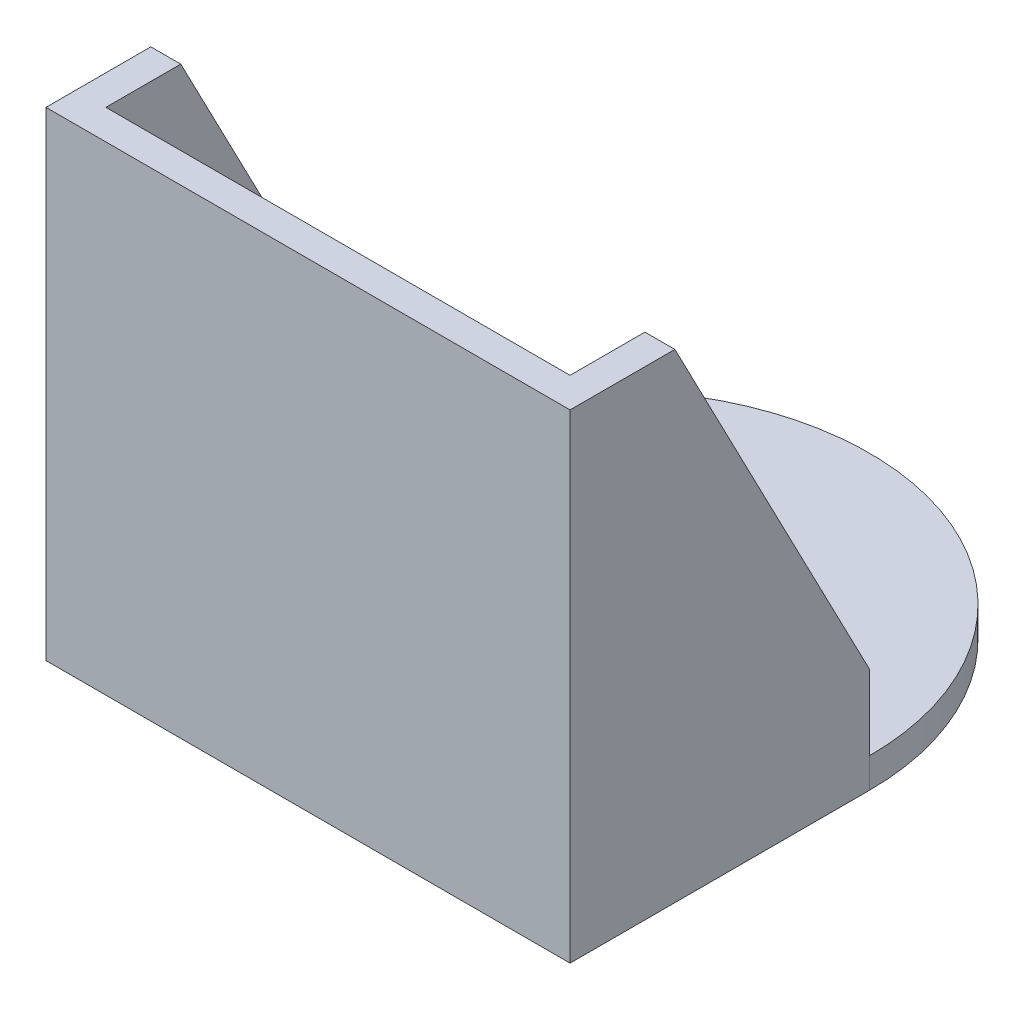
ISO-10303-21;
HEADER;
FILE_DESCRIPTION(('STEP AP214'),'2;1');
FILE_NAME('part.step','',(''),(''),'','','');
FILE_SCHEMA(('AUTOMOTIVE_DESIGN { 1 0 10303 214 1 1 1 1 }'));
ENDSEC;
DATA;
#1=APPLICATION_CONTEXT('core data for automotive mechanical design processes');
#2=APPLICATION_PROTOCOL_DEFINITION('international standard','automotive_design',2000,#1);
#3=PRODUCT_CONTEXT('',#1,'mechanical');
#4=PRODUCT('Part','Part','',(#3));
#5=PRODUCT_RELATED_PRODUCT_CATEGORY('part','',(#4));
#6=PRODUCT_DEFINITION_FORMATION('','',#4);
#7=PRODUCT_DEFINITION_CONTEXT('part definition',#1,'design');
#8=PRODUCT_DEFINITION('design','',#6,#7);
#9=PRODUCT_DEFINITION_SHAPE('','',#8);
#10=(LENGTH_UNIT() NAMED_UNIT(*) SI_UNIT(.MILLI.,.METRE.));
#11=(NAMED_UNIT(*) PLANE_ANGLE_UNIT() SI_UNIT($,.RADIAN.));
#12=(NAMED_UNIT(*) SI_UNIT($,.STERADIAN.) SOLID_ANGLE_UNIT());
#13=UNCERTAINTY_MEASURE_WITH_UNIT(LENGTH_MEASURE(1.E-05),#10,'distance_accuracy_value','');
#14=(GEOMETRIC_REPRESENTATION_CONTEXT(3) GLOBAL_UNCERTAINTY_ASSIGNED_CONTEXT((#13)) GLOBAL_UNIT_ASSIGNED_CONTEXT((#10,
#11,#12)) REPRESENTATION_CONTEXT('',''));
#15=CARTESIAN_POINT('',(0.,0.,0.));
#16=DIRECTION('',(0.,0.,1.));
#17=DIRECTION('',(1.,0.,0.));
#18=AXIS2_PLACEMENT_3D('',#15,#16,#17);
#19=CARTESIAN_POINT('',(0.,5.08,0.));
#20=DIRECTION('',(0.,1.,0.));
#21=DIRECTION('',(0.,0.,1.));
#22=AXIS2_PLACEMENT_3D('',#19,#20,#21);
#23=PLANE('',#22);
#24=CARTESIAN_POINT('',(21.9970452561247,5.08,12.7000000000001));
#25=DIRECTION('',(0.,1.,0.));
#26=DIRECTION('',(0.,0.,1.));
#27=AXIS2_PLACEMENT_3D('',#24,#25,#26);
#28=CIRCLE('',#27,1.22190067973917);
#29=CARTESIAN_POINT('',(21.9970452561247,5.08,13.9219006797393));
#30=VERTEX_POINT('',#29);
#31=EDGE_CURVE('E214',#30,#30,#28,.T.);
#32=ORIENTED_EDGE('',*,*,#31,.F.);
#33=EDGE_LOOP('',(#32));
#34=FACE_BOUND('',#33,.T.);
#35=CARTESIAN_POINT('',(0.,5.08,0.));
#36=DIRECTION('',(0.,1.,0.));
#37=DIRECTION('',(0.,0.,1.));
#38=AXIS2_PLACEMENT_3D('',#35,#36,#37);
#39=CIRCLE('',#38,19.05);
#40=CARTESIAN_POINT('',(0.,5.08,19.05));
#41=VERTEX_POINT('',#40);
#42=EDGE_CURVE('E226',#41,#41,#39,.T.);
#43=ORIENTED_EDGE('',*,*,#42,.F.);
#44=EDGE_LOOP('',(#43));
#45=FACE_BOUND('',#44,.T.);
#46=CARTESIAN_POINT('',(0.,5.08,-25.4));
#47=DIRECTION('',(0.,1.,0.));
#48=DIRECTION('',(0.,0.,1.));
#49=AXIS2_PLACEMENT_3D('',#46,#47,#48);
#50=CIRCLE('',#49,1.41062288217637);
#51=CARTESIAN_POINT('',(0.,5.08,-23.9893771178236));
#52=VERTEX_POINT('',#51);
#53=EDGE_CURVE('E220',#52,#52,#50,.T.);
#54=ORIENTED_EDGE('',*,*,#53,.F.);
#55=EDGE_LOOP('',(#54));
#56=FACE_BOUND('',#55,.T.);
#57=CARTESIAN_POINT('',(-21.9970452561249,5.08,12.6999999999998));
#58=DIRECTION('',(0.,1.,0.));
#59=DIRECTION('',(0.,0.,1.));
#60=AXIS2_PLACEMENT_3D('',#57,#58,#59);
#61=CIRCLE('',#60,0.971343813789559);
#62=CARTESIAN_POINT('',(-21.9970452561249,5.08,13.6713438137894));
#63=VERTEX_POINT('',#62);
#64=EDGE_CURVE('E208',#63,#63,#61,.T.);
#65=ORIENTED_EDGE('',*,*,#64,.F.);
#66=EDGE_LOOP('',(#65));
#67=FACE_BOUND('',#66,.T.);
#68=DIRECTION('',(0.,0.,1.));
#69=VECTOR('',#68,1.);
#70=CARTESIAN_POINT('',(39.37,5.08,0.));
#71=LINE('',#70,#69);
#72=CARTESIAN_POINT('',(39.37,5.08,0.));
#73=VERTEX_POINT('',#72);
#74=CARTESIAN_POINT('',(39.37,5.08,45.72));
#75=VERTEX_POINT('',#74);
#76=EDGE_CURVE('E48',#73,#75,#71,.T.);
#77=ORIENTED_EDGE('',*,*,#76,.F.);
#78=DIRECTION('',(1.,0.,0.));
#79=VECTOR('',#78,1.);
#80=CARTESIAN_POINT('',(39.37,5.08,0.));
#81=LINE('',#80,#79);
#82=CARTESIAN_POINT('',(44.45,5.08,0.));
#83=VERTEX_POINT('',#82);
#84=EDGE_CURVE('E137',#73,#83,#81,.T.);
#85=ORIENTED_EDGE('',*,*,#84,.T.);
#86=CARTESIAN_POINT('',(0.,5.08,0.));
#87=DIRECTION('',(0.,1.,0.));
#88=DIRECTION('',(0.,0.,1.));
#89=AXIS2_PLACEMENT_3D('',#86,#87,#88);
#90=CIRCLE('',#89,44.45);
#91=CARTESIAN_POINT('',(-44.45,5.08,0.));
#92=VERTEX_POINT('',#91);
#93=EDGE_CURVE('E11',#83,#92,#90,.T.);
#94=ORIENTED_EDGE('',*,*,#93,.T.);
#95=DIRECTION('',(-1.,0.,0.));
#96=VECTOR('',#95,1.);
#97=CARTESIAN_POINT('',(-39.37,5.08,0.));
#98=LINE('',#97,#96);
#99=CARTESIAN_POINT('',(-39.37,5.08,0.));
#100=VERTEX_POINT('',#99);
#101=EDGE_CURVE('E171',#100,#92,#98,.T.);
#102=ORIENTED_EDGE('',*,*,#101,.F.);
#103=DIRECTION('',(0.,0.,1.));
#104=VECTOR('',#103,1.);
#105=CARTESIAN_POINT('',(-39.37,5.08,0.));
#106=LINE('',#105,#104);
#107=CARTESIAN_POINT('',(-39.37,5.08,45.72));
#108=VERTEX_POINT('',#107);
#109=EDGE_CURVE('E151',#100,#108,#106,.T.);
#110=ORIENTED_EDGE('',*,*,#109,.T.);
#111=DIRECTION('',(1.,0.,0.));
#112=VECTOR('',#111,1.);
#113=CARTESIAN_POINT('',(-44.45,5.08,45.72));
#114=LINE('',#113,#112);
#115=EDGE_CURVE('E174',#108,#75,#114,.T.);
#116=ORIENTED_EDGE('',*,*,#115,.T.);
#117=EDGE_LOOP('',(#77,#85,#94,#102,#110,#116));
#118=FACE_BOUND('',#117,.T.);
#119=ADVANCED_FACE('F33',(#34,#45,#56,#67,#118),#23,.T.);
#120=CARTESIAN_POINT('',(0.,5.08,0.));
#121=DIRECTION('',(0.,-1.,0.));
#122=DIRECTION('',(0.,0.,-1.));
#123=AXIS2_PLACEMENT_3D('',#120,#121,#122);
#124=CYLINDRICAL_SURFACE('',#123,44.45);
#125=DIRECTION('',(0.,-1.,0.));
#126=VECTOR('',#125,1.);
#127=CARTESIAN_POINT('',(-44.45,107.470673403392,0.));
#128=LINE('',#127,#126);
#129=CARTESIAN_POINT('',(-44.45,0.,0.));
#130=VERTEX_POINT('',#129);
#131=EDGE_CURVE('E202',#92,#130,#128,.T.);
#132=ORIENTED_EDGE('',*,*,#131,.F.);
#133=ORIENTED_EDGE('',*,*,#93,.F.);
#134=DIRECTION('',(0.,-1.,0.));
#135=VECTOR('',#134,1.);
#136=CARTESIAN_POINT('',(44.45,107.470673403392,0.));
#137=LINE('',#136,#135);
#138=CARTESIAN_POINT('',(44.45,0.,0.));
#139=VERTEX_POINT('',#138);
#140=EDGE_CURVE('E189',#83,#139,#137,.T.);
#141=ORIENTED_EDGE('',*,*,#140,.T.);
#142=CARTESIAN_POINT('',(0.,0.,0.));
#143=DIRECTION('',(0.,1.,0.));
#144=DIRECTION('',(0.,0.,1.));
#145=AXIS2_PLACEMENT_3D('',#142,#143,#144);
#146=CIRCLE('',#145,44.45);
#147=EDGE_CURVE('E37',#139,#130,#146,.T.);
#148=ORIENTED_EDGE('',*,*,#147,.T.);
#149=EDGE_LOOP('',(#132,#133,#141,#148));
#150=FACE_BOUND('',#149,.T.);
#151=ADVANCED_FACE('F35',(#150),#124,.T.);
#152=CARTESIAN_POINT('',(0.,0.,0.));
#153=DIRECTION('',(0.,1.,0.));
#154=DIRECTION('',(0.,0.,1.));
#155=AXIS2_PLACEMENT_3D('',#152,#153,#154);
#156=PLANE('',#155);
#157=ORIENTED_EDGE('',*,*,#147,.F.);
#158=DIRECTION('',(0.,0.,-1.));
#159=VECTOR('',#158,1.);
#160=CARTESIAN_POINT('',(44.45,0.,50.8));
#161=LINE('',#160,#159);
#162=CARTESIAN_POINT('',(44.45,0.,50.8));
#163=VERTEX_POINT('',#162);
#164=EDGE_CURVE('E191',#163,#139,#161,.T.);
#165=ORIENTED_EDGE('',*,*,#164,.F.);
#166=DIRECTION('',(1.,0.,0.));
#167=VECTOR('',#166,1.);
#168=CARTESIAN_POINT('',(-44.45,0.,50.8));
#169=LINE('',#168,#167);
#170=CARTESIAN_POINT('',(-44.45,0.,50.8));
#171=VERTEX_POINT('',#170);
#172=EDGE_CURVE('E195',#171,#163,#169,.T.);
#173=ORIENTED_EDGE('',*,*,#172,.F.);
#174=DIRECTION('',(0.,0.,1.));
#175=VECTOR('',#174,1.);
#176=CARTESIAN_POINT('',(-44.45,0.,0.));
#177=LINE('',#176,#175);
#178=EDGE_CURVE('E199',#130,#171,#177,.T.);
#179=ORIENTED_EDGE('',*,*,#178,.F.);
#180=EDGE_LOOP('',(#157,#165,#173,#179));
#181=FACE_BOUND('',#180,.T.);
#182=CARTESIAN_POINT('',(0.,0.,0.));
#183=DIRECTION('',(0.,1.,0.));
#184=DIRECTION('',(0.,0.,1.));
#185=AXIS2_PLACEMENT_3D('',#182,#183,#184);
#186=CIRCLE('',#185,19.05);
#187=CARTESIAN_POINT('',(0.,0.,19.05));
#188=VERTEX_POINT('',#187);
#189=EDGE_CURVE('E223',#188,#188,#186,.T.);
#190=ORIENTED_EDGE('',*,*,#189,.T.);
#191=EDGE_LOOP('',(#190));
#192=FACE_BOUND('',#191,.T.);
#193=CARTESIAN_POINT('',(0.,0.,-25.4));
#194=DIRECTION('',(0.,1.,0.));
#195=DIRECTION('',(0.,0.,1.));
#196=AXIS2_PLACEMENT_3D('',#193,#194,#195);
#197=CIRCLE('',#196,1.41062288217637);
#198=CARTESIAN_POINT('',(0.,0.,-23.9893771178236));
#199=VERTEX_POINT('',#198);
#200=EDGE_CURVE('E217',#199,#199,#197,.T.);
#201=ORIENTED_EDGE('',*,*,#200,.T.);
#202=EDGE_LOOP('',(#201));
#203=FACE_BOUND('',#202,.T.);
#204=CARTESIAN_POINT('',(21.9970452561247,0.,12.7000000000001));
#205=DIRECTION('',(0.,1.,0.));
#206=DIRECTION('',(0.,0.,1.));
#207=AXIS2_PLACEMENT_3D('',#204,#205,#206);
#208=CIRCLE('',#207,1.22190067973917);
#209=CARTESIAN_POINT('',(21.9970452561247,0.,13.9219006797393));
#210=VERTEX_POINT('',#209);
#211=EDGE_CURVE('E211',#210,#210,#208,.T.);
#212=ORIENTED_EDGE('',*,*,#211,.T.);
#213=EDGE_LOOP('',(#212));
#214=FACE_BOUND('',#213,.T.);
#215=CARTESIAN_POINT('',(-21.9970452561249,0.,12.6999999999998));
#216=DIRECTION('',(0.,1.,0.));
#217=DIRECTION('',(0.,0.,1.));
#218=AXIS2_PLACEMENT_3D('',#215,#216,#217);
#219=CIRCLE('',#218,0.971343813789559);
#220=CARTESIAN_POINT('',(-21.9970452561249,0.,13.6713438137894));
#221=VERTEX_POINT('',#220);
#222=EDGE_CURVE('E193',#221,#221,#219,.T.);
#223=ORIENTED_EDGE('',*,*,#222,.T.);
#224=EDGE_LOOP('',(#223));
#225=FACE_BOUND('',#224,.T.);
#226=ADVANCED_FACE('F232',(#181,#192,#203,#214,#225),#156,.F.);
#227=CARTESIAN_POINT('',(0.,5.08,0.));
#228=DIRECTION('',(0.,-1.,0.));
#229=DIRECTION('',(0.,0.,-1.));
#230=AXIS2_PLACEMENT_3D('',#227,#228,#229);
#231=CYLINDRICAL_SURFACE('',#230,19.05);
#232=ORIENTED_EDGE('',*,*,#42,.T.);
#233=EDGE_LOOP('',(#232));
#234=FACE_BOUND('',#233,.T.);
#235=ORIENTED_EDGE('',*,*,#189,.F.);
#236=EDGE_LOOP('',(#235));
#237=FACE_BOUND('',#236,.T.);
#238=ADVANCED_FACE('F235',(#234,#237),#231,.F.);
#239=CARTESIAN_POINT('',(0.,5.08,-25.4));
#240=DIRECTION('',(0.,-1.,0.));
#241=DIRECTION('',(0.,0.,-1.));
#242=AXIS2_PLACEMENT_3D('',#239,#240,#241);
#243=CYLINDRICAL_SURFACE('',#242,1.41062288217637);
#244=ORIENTED_EDGE('',*,*,#53,.T.);
#245=EDGE_LOOP('',(#244));
#246=FACE_BOUND('',#245,.T.);
#247=ORIENTED_EDGE('',*,*,#200,.F.);
#248=EDGE_LOOP('',(#247));
#249=FACE_BOUND('',#248,.T.);
#250=ADVANCED_FACE('F237',(#246,#249),#243,.F.);
#251=CARTESIAN_POINT('',(21.9970452561247,5.08,12.7000000000001));
#252=DIRECTION('',(0.,-1.,0.));
#253=DIRECTION('',(0.,0.,-1.));
#254=AXIS2_PLACEMENT_3D('',#251,#252,#253);
#255=CYLINDRICAL_SURFACE('',#254,1.22190067973917);
#256=ORIENTED_EDGE('',*,*,#31,.T.);
#257=EDGE_LOOP('',(#256));
#258=FACE_BOUND('',#257,.T.);
#259=ORIENTED_EDGE('',*,*,#211,.F.);
#260=EDGE_LOOP('',(#259));
#261=FACE_BOUND('',#260,.T.);
#262=ADVANCED_FACE('F244',(#258,#261),#255,.F.);
#263=CARTESIAN_POINT('',(-21.9970452561249,5.08,12.6999999999998));
#264=DIRECTION('',(0.,-1.,0.));
#265=DIRECTION('',(0.,0.,-1.));
#266=AXIS2_PLACEMENT_3D('',#263,#264,#265);
#267=CYLINDRICAL_SURFACE('',#266,0.971343813789559);
#268=ORIENTED_EDGE('',*,*,#64,.T.);
#269=EDGE_LOOP('',(#268));
#270=FACE_BOUND('',#269,.T.);
#271=ORIENTED_EDGE('',*,*,#222,.F.);
#272=EDGE_LOOP('',(#271));
#273=FACE_BOUND('',#272,.T.);
#274=ADVANCED_FACE('F263',(#270,#273),#267,.F.);
#275=CARTESIAN_POINT('',(-44.45,107.470673403392,0.));
#276=DIRECTION('',(1.,0.,0.));
#277=DIRECTION('',(0.,0.,-1.));
#278=AXIS2_PLACEMENT_3D('',#275,#276,#277);
#279=PLANE('',#278);
#280=DIRECTION('',(0.,-1.,0.));
#281=VECTOR('',#280,1.);
#282=CARTESIAN_POINT('',(-44.45,5.08,0.));
#283=LINE('',#282,#281);
#284=CARTESIAN_POINT('',(-44.45,17.78,0.));
#285=VERTEX_POINT('',#284);
#286=EDGE_CURVE('E154',#285,#92,#283,.T.);
#287=ORIENTED_EDGE('',*,*,#286,.T.);
#288=ORIENTED_EDGE('',*,*,#131,.T.);
#289=ORIENTED_EDGE('',*,*,#178,.T.);
#290=DIRECTION('',(0.,-1.,0.));
#291=VECTOR('',#290,1.);
#292=CARTESIAN_POINT('',(-44.45,107.470673403392,50.8));
#293=LINE('',#292,#291);
#294=CARTESIAN_POINT('',(-44.45,81.28,50.8));
#295=VERTEX_POINT('',#294);
#296=EDGE_CURVE('E198',#295,#171,#293,.T.);
#297=ORIENTED_EDGE('',*,*,#296,.F.);
#298=DIRECTION('',(0.,0.,-1.));
#299=VECTOR('',#298,1.);
#300=CARTESIAN_POINT('',(-44.45,81.28,50.8));
#301=LINE('',#300,#299);
#302=CARTESIAN_POINT('',(-44.45,81.28,33.02));
#303=VERTEX_POINT('',#302);
#304=EDGE_CURVE('E187',#295,#303,#301,.T.);
#305=ORIENTED_EDGE('',*,*,#304,.T.);
#306=DIRECTION('',(0.,-0.887216801234595,-0.461352736641989));
#307=VECTOR('',#306,1.);
#308=CARTESIAN_POINT('',(-44.45,17.78,0.));
#309=LINE('',#308,#307);
#310=EDGE_CURVE('E148',#303,#285,#309,.T.);
#311=ORIENTED_EDGE('',*,*,#310,.T.);
#312=EDGE_LOOP('',(#287,#288,#289,#297,#305,#311));
#313=FACE_BOUND('',#312,.T.);
#314=ADVANCED_FACE('F266',(#313),#279,.F.);
#315=CARTESIAN_POINT('',(-44.45,107.470673403392,50.8));
#316=DIRECTION('',(0.,0.,-1.));
#317=DIRECTION('',(-1.,0.,0.));
#318=AXIS2_PLACEMENT_3D('',#315,#316,#317);
#319=PLANE('',#318);
#320=DIRECTION('',(0.,-1.,0.));
#321=VECTOR('',#320,1.);
#322=CARTESIAN_POINT('',(44.45,107.470673403392,50.8));
#323=LINE('',#322,#321);
#324=CARTESIAN_POINT('',(44.45,81.28,50.8));
#325=VERTEX_POINT('',#324);
#326=EDGE_CURVE('E194',#325,#163,#323,.T.);
#327=ORIENTED_EDGE('',*,*,#326,.F.);
#328=DIRECTION('',(1.,0.,0.));
#329=VECTOR('',#328,1.);
#330=CARTESIAN_POINT('',(-44.45,81.28,50.8));
#331=LINE('',#330,#329);
#332=EDGE_CURVE('E179',#295,#325,#331,.T.);
#333=ORIENTED_EDGE('',*,*,#332,.F.);
#334=ORIENTED_EDGE('',*,*,#296,.T.);
#335=ORIENTED_EDGE('',*,*,#172,.T.);
#336=EDGE_LOOP('',(#327,#333,#334,#335));
#337=FACE_BOUND('',#336,.T.);
#338=ADVANCED_FACE('F274',(#337),#319,.F.);
#339=CARTESIAN_POINT('',(44.45,107.470673403392,50.8));
#340=DIRECTION('',(-1.,0.,0.));
#341=DIRECTION('',(0.,0.,1.));
#342=AXIS2_PLACEMENT_3D('',#339,#340,#341);
#343=PLANE('',#342);
#344=ORIENTED_EDGE('',*,*,#140,.F.);
#345=DIRECTION('',(0.,-1.,0.));
#346=VECTOR('',#345,1.);
#347=CARTESIAN_POINT('',(44.45,5.08,0.));
#348=LINE('',#347,#346);
#349=CARTESIAN_POINT('',(44.45,17.78,0.));
#350=VERTEX_POINT('',#349);
#351=EDGE_CURVE('E145',#350,#83,#348,.T.);
#352=ORIENTED_EDGE('',*,*,#351,.F.);
#353=DIRECTION('',(0.,-0.887216801234595,-0.461352736641989));
#354=VECTOR('',#353,1.);
#355=CARTESIAN_POINT('',(44.45,17.78,0.));
#356=LINE('',#355,#354);
#357=CARTESIAN_POINT('',(44.45,81.28,33.02));
#358=VERTEX_POINT('',#357);
#359=EDGE_CURVE('E132',#358,#350,#356,.T.);
#360=ORIENTED_EDGE('',*,*,#359,.F.);
#361=DIRECTION('',(0.,0.,1.));
#362=VECTOR('',#361,1.);
#363=CARTESIAN_POINT('',(44.45,81.28,45.72));
#364=LINE('',#363,#362);
#365=EDGE_CURVE('E182',#358,#325,#364,.T.);
#366=ORIENTED_EDGE('',*,*,#365,.T.);
#367=ORIENTED_EDGE('',*,*,#326,.T.);
#368=ORIENTED_EDGE('',*,*,#164,.T.);
#369=EDGE_LOOP('',(#344,#352,#360,#366,#367,#368));
#370=FACE_BOUND('',#369,.T.);
#371=ADVANCED_FACE('F282',(#370),#343,.F.);
#372=CARTESIAN_POINT('',(-44.45,81.28,45.72));
#373=DIRECTION('',(0.,0.,-1.));
#374=DIRECTION('',(-1.,0.,0.));
#375=AXIS2_PLACEMENT_3D('',#372,#373,#374);
#376=PLANE('',#375);
#377=DIRECTION('',(0.,1.,0.));
#378=VECTOR('',#377,1.);
#379=CARTESIAN_POINT('',(39.37,81.28,45.72));
#380=LINE('',#379,#378);
#381=CARTESIAN_POINT('',(39.37,81.28,45.72));
#382=VERTEX_POINT('',#381);
#383=EDGE_CURVE('E56',#75,#382,#380,.T.);
#384=ORIENTED_EDGE('',*,*,#383,.F.);
#385=ORIENTED_EDGE('',*,*,#115,.F.);
#386=DIRECTION('',(0.,1.,0.));
#387=VECTOR('',#386,1.);
#388=CARTESIAN_POINT('',(-39.37,81.28,45.72));
#389=LINE('',#388,#387);
#390=CARTESIAN_POINT('',(-39.37,81.28,45.72));
#391=VERTEX_POINT('',#390);
#392=EDGE_CURVE('E153',#108,#391,#389,.T.);
#393=ORIENTED_EDGE('',*,*,#392,.T.);
#394=DIRECTION('',(1.,0.,0.));
#395=VECTOR('',#394,1.);
#396=CARTESIAN_POINT('',(-44.45,81.28,45.72));
#397=LINE('',#396,#395);
#398=EDGE_CURVE('E185',#391,#382,#397,.T.);
#399=ORIENTED_EDGE('',*,*,#398,.T.);
#400=EDGE_LOOP('',(#384,#385,#393,#399));
#401=FACE_BOUND('',#400,.T.);
#402=ADVANCED_FACE('F286',(#401),#376,.T.);
#403=CARTESIAN_POINT('',(0.,81.28,0.));
#404=DIRECTION('',(0.,-1.,0.));
#405=DIRECTION('',(-1.,0.,0.));
#406=AXIS2_PLACEMENT_3D('',#403,#404,#405);
#407=PLANE('',#406);
#408=ORIENTED_EDGE('',*,*,#332,.T.);
#409=ORIENTED_EDGE('',*,*,#365,.F.);
#410=DIRECTION('',(1.,0.,0.));
#411=VECTOR('',#410,1.);
#412=CARTESIAN_POINT('',(39.37,81.28,33.02));
#413=LINE('',#412,#411);
#414=CARTESIAN_POINT('',(39.37,81.28,33.02));
#415=VERTEX_POINT('',#414);
#416=EDGE_CURVE('E136',#415,#358,#413,.T.);
#417=ORIENTED_EDGE('',*,*,#416,.F.);
#418=DIRECTION('',(0.,0.,-1.));
#419=VECTOR('',#418,1.);
#420=CARTESIAN_POINT('',(39.37,81.28,33.02));
#421=LINE('',#420,#419);
#422=EDGE_CURVE('E123',#382,#415,#421,.T.);
#423=ORIENTED_EDGE('',*,*,#422,.F.);
#424=ORIENTED_EDGE('',*,*,#398,.F.);
#425=DIRECTION('',(0.,0.,-1.));
#426=VECTOR('',#425,1.);
#427=CARTESIAN_POINT('',(-39.37,81.28,33.02));
#428=LINE('',#427,#426);
#429=CARTESIAN_POINT('',(-39.37,81.28,33.02));
#430=VERTEX_POINT('',#429);
#431=EDGE_CURVE('E157',#391,#430,#428,.T.);
#432=ORIENTED_EDGE('',*,*,#431,.T.);
#433=DIRECTION('',(-1.,0.,0.));
#434=VECTOR('',#433,1.);
#435=CARTESIAN_POINT('',(-39.37,81.28,33.02));
#436=LINE('',#435,#434);
#437=EDGE_CURVE('E166',#430,#303,#436,.T.);
#438=ORIENTED_EDGE('',*,*,#437,.T.);
#439=ORIENTED_EDGE('',*,*,#304,.F.);
#440=EDGE_LOOP('',(#408,#409,#417,#423,#424,#432,#438,#439));
#441=FACE_BOUND('',#440,.T.);
#442=ADVANCED_FACE('F290',(#441),#407,.F.);
#443=CARTESIAN_POINT('',(-39.37,5.08,0.));
#444=DIRECTION('',(0.,0.,-1.));
#445=DIRECTION('',(-1.,0.,0.));
#446=AXIS2_PLACEMENT_3D('',#443,#444,#445);
#447=PLANE('',#446);
#448=ORIENTED_EDGE('',*,*,#286,.F.);
#449=DIRECTION('',(-1.,0.,0.));
#450=VECTOR('',#449,1.);
#451=CARTESIAN_POINT('',(-39.37,17.78,0.));
#452=LINE('',#451,#450);
#453=CARTESIAN_POINT('',(-39.37,17.78,0.));
#454=VERTEX_POINT('',#453);
#455=EDGE_CURVE('E175',#454,#285,#452,.T.);
#456=ORIENTED_EDGE('',*,*,#455,.F.);
#457=DIRECTION('',(0.,-1.,0.));
#458=VECTOR('',#457,1.);
#459=CARTESIAN_POINT('',(-39.37,5.08,0.));
#460=LINE('',#459,#458);
#461=EDGE_CURVE('E163',#454,#100,#460,.T.);
#462=ORIENTED_EDGE('',*,*,#461,.T.);
#463=ORIENTED_EDGE('',*,*,#101,.T.);
#464=EDGE_LOOP('',(#448,#456,#462,#463));
#465=FACE_BOUND('',#464,.T.);
#466=ADVANCED_FACE('F293',(#465),#447,.T.);
#467=CARTESIAN_POINT('',(-39.37,17.78,0.));
#468=DIRECTION('',(0.,0.461352736641989,-0.887216801234595));
#469=DIRECTION('',(0.,0.887216801234595,0.461352736641989));
#470=AXIS2_PLACEMENT_3D('',#467,#468,#469);
#471=PLANE('',#470);
#472=ORIENTED_EDGE('',*,*,#310,.F.);
#473=ORIENTED_EDGE('',*,*,#437,.F.);
#474=DIRECTION('',(0.,-0.887216801234595,-0.461352736641989));
#475=VECTOR('',#474,1.);
#476=CARTESIAN_POINT('',(-39.37,17.78,0.));
#477=LINE('',#476,#475);
#478=EDGE_CURVE('E160',#430,#454,#477,.T.);
#479=ORIENTED_EDGE('',*,*,#478,.T.);
#480=ORIENTED_EDGE('',*,*,#455,.T.);
#481=EDGE_LOOP('',(#472,#473,#479,#480));
#482=FACE_BOUND('',#481,.T.);
#483=ADVANCED_FACE('F295',(#482),#471,.T.);
#484=CARTESIAN_POINT('',(-39.37,0.,0.));
#485=DIRECTION('',(1.,0.,0.));
#486=DIRECTION('',(0.,0.,-1.));
#487=AXIS2_PLACEMENT_3D('',#484,#485,#486);
#488=PLANE('',#487);
#489=ORIENTED_EDGE('',*,*,#109,.F.);
#490=ORIENTED_EDGE('',*,*,#461,.F.);
#491=ORIENTED_EDGE('',*,*,#478,.F.);
#492=ORIENTED_EDGE('',*,*,#431,.F.);
#493=ORIENTED_EDGE('',*,*,#392,.F.);
#494=EDGE_LOOP('',(#489,#490,#491,#492,#493));
#495=FACE_BOUND('',#494,.T.);
#496=ADVANCED_FACE('F298',(#495),#488,.T.);
#497=CARTESIAN_POINT('',(39.37,17.78,0.));
#498=DIRECTION('',(0.,-0.461352736641989,0.887216801234595));
#499=DIRECTION('',(0.,-0.887216801234595,-0.461352736641989));
#500=AXIS2_PLACEMENT_3D('',#497,#498,#499);
#501=PLANE('',#500);
#502=ORIENTED_EDGE('',*,*,#359,.T.);
#503=DIRECTION('',(1.,0.,0.));
#504=VECTOR('',#503,1.);
#505=CARTESIAN_POINT('',(39.37,17.78,0.));
#506=LINE('',#505,#504);
#507=CARTESIAN_POINT('',(39.37,17.78,0.));
#508=VERTEX_POINT('',#507);
#509=EDGE_CURVE('E129',#508,#350,#506,.T.);
#510=ORIENTED_EDGE('',*,*,#509,.F.);
#511=DIRECTION('',(0.,-0.887216801234595,-0.461352736641989));
#512=VECTOR('',#511,1.);
#513=CARTESIAN_POINT('',(39.37,17.78,0.));
#514=LINE('',#513,#512);
#515=EDGE_CURVE('E116',#415,#508,#514,.T.);
#516=ORIENTED_EDGE('',*,*,#515,.F.);
#517=ORIENTED_EDGE('',*,*,#416,.T.);
#518=EDGE_LOOP('',(#502,#510,#516,#517));
#519=FACE_BOUND('',#518,.T.);
#520=ADVANCED_FACE('F130',(#519),#501,.F.);
#521=CARTESIAN_POINT('',(39.37,5.08,0.));
#522=DIRECTION('',(0.,0.,1.));
#523=DIRECTION('',(1.,0.,0.));
#524=AXIS2_PLACEMENT_3D('',#521,#522,#523);
#525=PLANE('',#524);
#526=ORIENTED_EDGE('',*,*,#351,.T.);
#527=ORIENTED_EDGE('',*,*,#84,.F.);
#528=DIRECTION('',(0.,-1.,0.));
#529=VECTOR('',#528,1.);
#530=CARTESIAN_POINT('',(39.37,5.08,0.));
#531=LINE('',#530,#529);
#532=EDGE_CURVE('E120',#508,#73,#531,.T.);
#533=ORIENTED_EDGE('',*,*,#532,.F.);
#534=ORIENTED_EDGE('',*,*,#509,.T.);
#535=EDGE_LOOP('',(#526,#527,#533,#534));
#536=FACE_BOUND('',#535,.T.);
#537=ADVANCED_FACE('F139',(#536),#525,.F.);
#538=CARTESIAN_POINT('',(39.37,0.,0.));
#539=DIRECTION('',(-1.,0.,0.));
#540=DIRECTION('',(0.,0.,-1.));
#541=AXIS2_PLACEMENT_3D('',#538,#539,#540);
#542=PLANE('',#541);
#543=ORIENTED_EDGE('',*,*,#76,.T.);
#544=ORIENTED_EDGE('',*,*,#383,.T.);
#545=ORIENTED_EDGE('',*,*,#422,.T.);
#546=ORIENTED_EDGE('',*,*,#515,.T.);
#547=ORIENTED_EDGE('',*,*,#532,.T.);
#548=EDGE_LOOP('',(#543,#544,#545,#546,#547));
#549=FACE_BOUND('',#548,.T.);
#550=ADVANCED_FACE('F118',(#549),#542,.T.);
#551=CLOSED_SHELL('',(#119,#151,#226,#238,#250,#262,#274,#314,#338,#371,#402,#442,#466,#483,
#496,#520,#537,#550));
#552=MANIFOLD_SOLID_BREP('B2',#551);
#553=ADVANCED_BREP_SHAPE_REPRESENTATION('',(#18,#552),#14);
#554=SHAPE_DEFINITION_REPRESENTATION(#9,#553);
ENDSEC;
END-ISO-10303-21;
